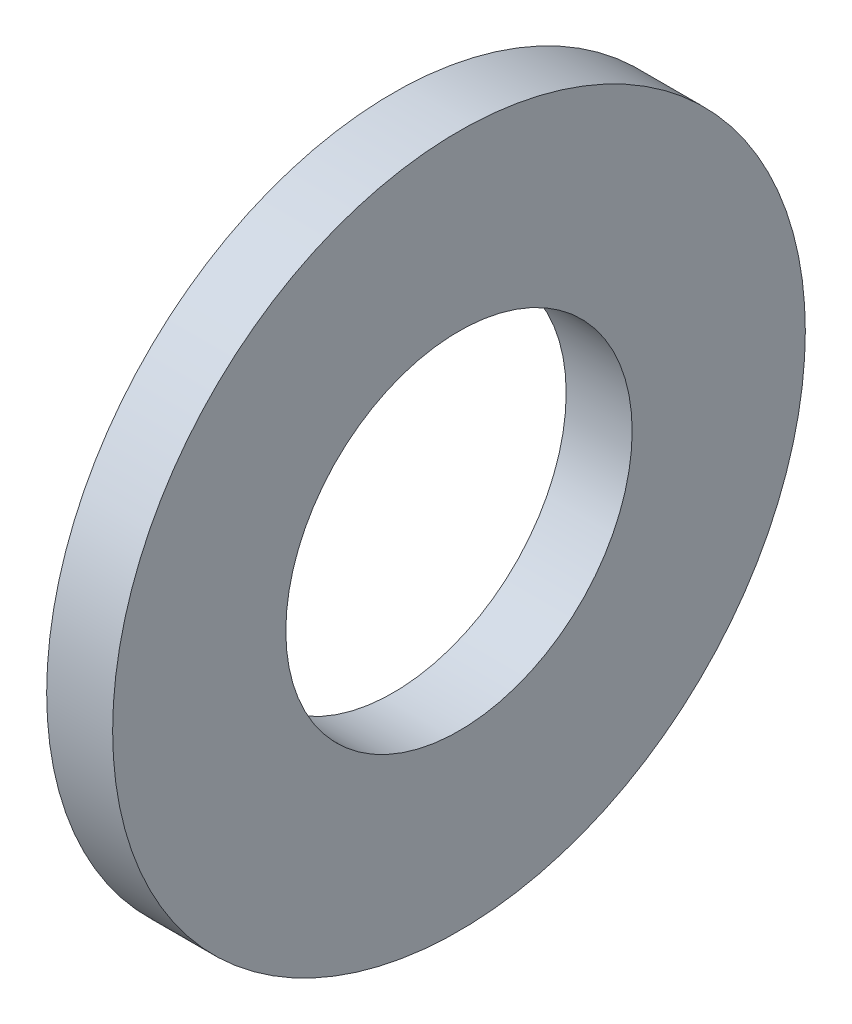
ISO-10303-21;
HEADER;
FILE_DESCRIPTION(('STEP AP214'),'2;1');
FILE_NAME('part.step','',(''),(''),'','','');
FILE_SCHEMA(('AUTOMOTIVE_DESIGN { 1 0 10303 214 1 1 1 1 }'));
ENDSEC;
DATA;
#1=APPLICATION_CONTEXT('core data for automotive mechanical design processes');
#2=APPLICATION_PROTOCOL_DEFINITION('international standard','automotive_design',2000,#1);
#3=PRODUCT_CONTEXT('',#1,'mechanical');
#4=PRODUCT('Part','Part','',(#3));
#5=PRODUCT_RELATED_PRODUCT_CATEGORY('part','',(#4));
#6=PRODUCT_DEFINITION_FORMATION('','',#4);
#7=PRODUCT_DEFINITION_CONTEXT('part definition',#1,'design');
#8=PRODUCT_DEFINITION('design','',#6,#7);
#9=PRODUCT_DEFINITION_SHAPE('','',#8);
#10=(LENGTH_UNIT() NAMED_UNIT(*) SI_UNIT(.MILLI.,.METRE.));
#11=(NAMED_UNIT(*) PLANE_ANGLE_UNIT() SI_UNIT($,.RADIAN.));
#12=(NAMED_UNIT(*) SI_UNIT($,.STERADIAN.) SOLID_ANGLE_UNIT());
#13=UNCERTAINTY_MEASURE_WITH_UNIT(LENGTH_MEASURE(1.E-05),#10,'distance_accuracy_value','');
#14=(GEOMETRIC_REPRESENTATION_CONTEXT(3) GLOBAL_UNCERTAINTY_ASSIGNED_CONTEXT((#13)) GLOBAL_UNIT_ASSIGNED_CONTEXT((#10,
#11,#12)) REPRESENTATION_CONTEXT('',''));
#15=CARTESIAN_POINT('',(0.,0.,0.));
#16=DIRECTION('',(0.,0.,1.));
#17=DIRECTION('',(1.,0.,0.));
#18=AXIS2_PLACEMENT_3D('',#15,#16,#17);
#19=CARTESIAN_POINT('',(-34.9249999999999,0.,0.));
#20=DIRECTION('',(-1.,0.,0.));
#21=DIRECTION('',(0.,0.,1.));
#22=AXIS2_PLACEMENT_3D('',#19,#20,#21);
#23=CYLINDRICAL_SURFACE('',#22,5.25);
#24=CARTESIAN_POINT('',(0.,0.,0.));
#25=DIRECTION('',(-1.,0.,0.));
#26=DIRECTION('',(0.,0.,1.));
#27=AXIS2_PLACEMENT_3D('',#24,#25,#26);
#28=CIRCLE('',#27,5.25);
#29=CARTESIAN_POINT('',(0.,0.,5.25));
#30=VERTEX_POINT('',#29);
#31=EDGE_CURVE('E42',#30,#30,#28,.T.);
#32=ORIENTED_EDGE('',*,*,#31,.F.);
#33=EDGE_LOOP('',(#32));
#34=FACE_BOUND('',#33,.T.);
#35=CARTESIAN_POINT('',(-2.,0.,0.));
#36=DIRECTION('',(-1.,0.,0.));
#37=DIRECTION('',(0.,0.,1.));
#38=AXIS2_PLACEMENT_3D('',#35,#36,#37);
#39=CIRCLE('',#38,5.25);
#40=CARTESIAN_POINT('',(-2.,0.,5.25));
#41=VERTEX_POINT('',#40);
#42=EDGE_CURVE('E10',#41,#41,#39,.T.);
#43=ORIENTED_EDGE('',*,*,#42,.T.);
#44=EDGE_LOOP('',(#43));
#45=FACE_BOUND('',#44,.T.);
#46=ADVANCED_FACE('F28',(#34,#45),#23,.F.);
#47=CARTESIAN_POINT('',(-2.,10.5,0.));
#48=DIRECTION('',(1.,0.,0.));
#49=DIRECTION('',(0.,0.,-1.));
#50=AXIS2_PLACEMENT_3D('',#47,#48,#49);
#51=PLANE('',#50);
#52=ORIENTED_EDGE('',*,*,#42,.F.);
#53=EDGE_LOOP('',(#52));
#54=FACE_BOUND('',#53,.T.);
#55=CARTESIAN_POINT('',(-2.,0.,0.));
#56=DIRECTION('',(-1.,0.,0.));
#57=DIRECTION('',(0.,0.,1.));
#58=AXIS2_PLACEMENT_3D('',#55,#56,#57);
#59=CIRCLE('',#58,10.5);
#60=CARTESIAN_POINT('',(-2.,0.,10.5));
#61=VERTEX_POINT('',#60);
#62=EDGE_CURVE('E34',#61,#61,#59,.T.);
#63=ORIENTED_EDGE('',*,*,#62,.T.);
#64=EDGE_LOOP('',(#63));
#65=FACE_BOUND('',#64,.T.);
#66=ADVANCED_FACE('F51',(#54,#65),#51,.F.);
#67=CARTESIAN_POINT('',(-34.9249999999999,0.,0.));
#68=DIRECTION('',(-1.,0.,0.));
#69=DIRECTION('',(0.,0.,1.));
#70=AXIS2_PLACEMENT_3D('',#67,#68,#69);
#71=CYLINDRICAL_SURFACE('',#70,10.5);
#72=ORIENTED_EDGE('',*,*,#62,.F.);
#73=EDGE_LOOP('',(#72));
#74=FACE_BOUND('',#73,.T.);
#75=CARTESIAN_POINT('',(0.,0.,0.));
#76=DIRECTION('',(-1.,0.,0.));
#77=DIRECTION('',(0.,0.,1.));
#78=AXIS2_PLACEMENT_3D('',#75,#76,#77);
#79=CIRCLE('',#78,10.5);
#80=CARTESIAN_POINT('',(0.,0.,10.5));
#81=VERTEX_POINT('',#80);
#82=EDGE_CURVE('E38',#81,#81,#79,.T.);
#83=ORIENTED_EDGE('',*,*,#82,.T.);
#84=EDGE_LOOP('',(#83));
#85=FACE_BOUND('',#84,.T.);
#86=ADVANCED_FACE('F55',(#74,#85),#71,.T.);
#87=CARTESIAN_POINT('',(0.,5.25,0.));
#88=DIRECTION('',(-1.,0.,0.));
#89=DIRECTION('',(0.,0.,1.));
#90=AXIS2_PLACEMENT_3D('',#87,#88,#89);
#91=PLANE('',#90);
#92=ORIENTED_EDGE('',*,*,#82,.F.);
#93=EDGE_LOOP('',(#92));
#94=FACE_BOUND('',#93,.T.);
#95=ORIENTED_EDGE('',*,*,#31,.T.);
#96=EDGE_LOOP('',(#95));
#97=FACE_BOUND('',#96,.T.);
#98=ADVANCED_FACE('F48',(#94,#97),#91,.F.);
#99=CLOSED_SHELL('',(#46,#66,#86,#98));
#100=MANIFOLD_SOLID_BREP('B2',#99);
#101=ADVANCED_BREP_SHAPE_REPRESENTATION('',(#18,#100),#14);
#102=SHAPE_DEFINITION_REPRESENTATION(#9,#101);
ENDSEC;
END-ISO-10303-21;
